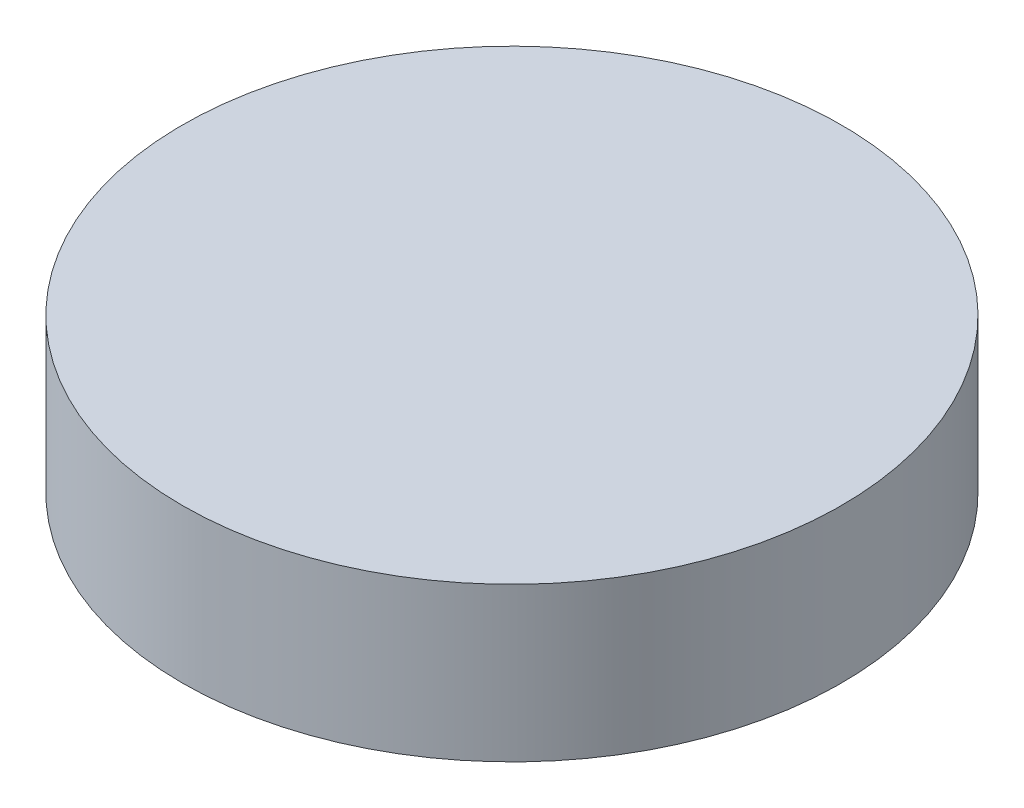
ISO-10303-21;
HEADER;
FILE_DESCRIPTION(('STEP AP214'),'2;1');
FILE_NAME('part.step','',(''),(''),'','','');
FILE_SCHEMA(('AUTOMOTIVE_DESIGN { 1 0 10303 214 1 1 1 1 }'));
ENDSEC;
DATA;
#1=APPLICATION_CONTEXT('core data for automotive mechanical design processes');
#2=APPLICATION_PROTOCOL_DEFINITION('international standard','automotive_design',2000,#1);
#3=PRODUCT_CONTEXT('',#1,'mechanical');
#4=PRODUCT('Part','Part','',(#3));
#5=PRODUCT_RELATED_PRODUCT_CATEGORY('part','',(#4));
#6=PRODUCT_DEFINITION_FORMATION('','',#4);
#7=PRODUCT_DEFINITION_CONTEXT('part definition',#1,'design');
#8=PRODUCT_DEFINITION('design','',#6,#7);
#9=PRODUCT_DEFINITION_SHAPE('','',#8);
#10=(LENGTH_UNIT() NAMED_UNIT(*) SI_UNIT(.MILLI.,.METRE.));
#11=(NAMED_UNIT(*) PLANE_ANGLE_UNIT() SI_UNIT($,.RADIAN.));
#12=(NAMED_UNIT(*) SI_UNIT($,.STERADIAN.) SOLID_ANGLE_UNIT());
#13=UNCERTAINTY_MEASURE_WITH_UNIT(LENGTH_MEASURE(1.E-05),#10,'distance_accuracy_value','');
#14=(GEOMETRIC_REPRESENTATION_CONTEXT(3) GLOBAL_UNCERTAINTY_ASSIGNED_CONTEXT((#13)) GLOBAL_UNIT_ASSIGNED_CONTEXT((#10,
#11,#12)) REPRESENTATION_CONTEXT('',''));
#15=CARTESIAN_POINT('',(0.,0.,0.));
#16=DIRECTION('',(0.,0.,1.));
#17=DIRECTION('',(1.,0.,0.));
#18=AXIS2_PLACEMENT_3D('',#15,#16,#17);
#19=CARTESIAN_POINT('',(0.,4.9,0.));
#20=DIRECTION('',(0.,-1.,0.));
#21=DIRECTION('',(0.,0.,-1.));
#22=AXIS2_PLACEMENT_3D('',#19,#20,#21);
#23=CYLINDRICAL_SURFACE('',#22,10.5);
#24=CARTESIAN_POINT('',(0.,4.9,0.));
#25=DIRECTION('',(0.,1.,0.));
#26=DIRECTION('',(0.,0.,1.));
#27=AXIS2_PLACEMENT_3D('',#24,#25,#26);
#28=CIRCLE('',#27,10.5);
#29=CARTESIAN_POINT('',(0.,4.9,10.5));
#30=VERTEX_POINT('',#29);
#31=EDGE_CURVE('E10',#30,#30,#28,.T.);
#32=ORIENTED_EDGE('',*,*,#31,.F.);
#33=EDGE_LOOP('',(#32));
#34=FACE_BOUND('',#33,.T.);
#35=CARTESIAN_POINT('',(0.,0.,0.));
#36=DIRECTION('',(0.,1.,0.));
#37=DIRECTION('',(0.,0.,1.));
#38=AXIS2_PLACEMENT_3D('',#35,#36,#37);
#39=CIRCLE('',#38,10.5);
#40=CARTESIAN_POINT('',(0.,0.,10.5));
#41=VERTEX_POINT('',#40);
#42=EDGE_CURVE('E44',#41,#41,#39,.T.);
#43=ORIENTED_EDGE('',*,*,#42,.T.);
#44=EDGE_LOOP('',(#43));
#45=FACE_BOUND('',#44,.T.);
#46=ADVANCED_FACE('F41',(#34,#45),#23,.T.);
#47=CARTESIAN_POINT('',(0.,4.9,0.));
#48=DIRECTION('',(0.,1.,0.));
#49=DIRECTION('',(0.,0.,1.));
#50=AXIS2_PLACEMENT_3D('',#47,#48,#49);
#51=PLANE('',#50);
#52=ORIENTED_EDGE('',*,*,#31,.T.);
#53=EDGE_LOOP('',(#52));
#54=FACE_BOUND('',#53,.T.);
#55=ADVANCED_FACE('F58',(#54),#51,.T.);
#56=CARTESIAN_POINT('',(0.,0.,0.));
#57=DIRECTION('',(0.,1.,0.));
#58=DIRECTION('',(0.,0.,1.));
#59=AXIS2_PLACEMENT_3D('',#56,#57,#58);
#60=PLANE('',#59);
#61=ORIENTED_EDGE('',*,*,#42,.F.);
#62=EDGE_LOOP('',(#61));
#63=FACE_BOUND('',#62,.T.);
#64=ADVANCED_FACE('F56',(#63),#60,.F.);
#65=CLOSED_SHELL('',(#46,#55,#64));
#66=MANIFOLD_SOLID_BREP('B2',#65);
#67=ADVANCED_BREP_SHAPE_REPRESENTATION('',(#18,#66),#14);
#68=SHAPE_DEFINITION_REPRESENTATION(#9,#67);
ENDSEC;
END-ISO-10303-21;
